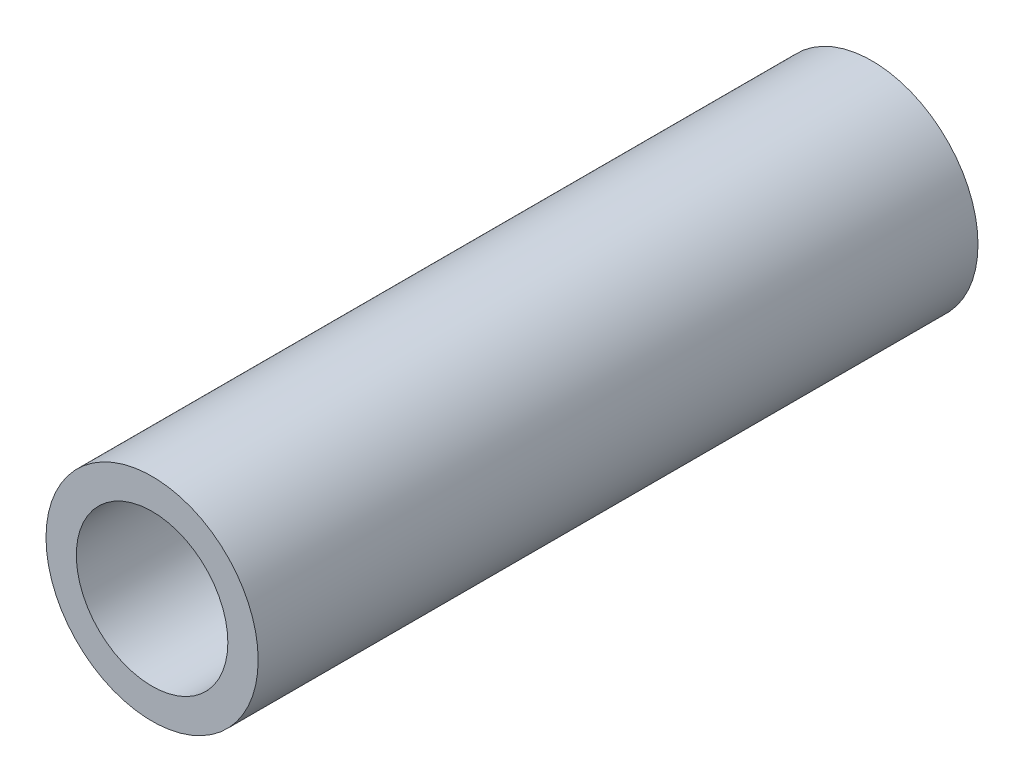
ISO-10303-21;
HEADER;
FILE_DESCRIPTION(('STEP AP214'),'2;1');
FILE_NAME('part.step','',(''),(''),'','','');
FILE_SCHEMA(('AUTOMOTIVE_DESIGN { 1 0 10303 214 1 1 1 1 }'));
ENDSEC;
DATA;
#1=APPLICATION_CONTEXT('core data for automotive mechanical design processes');
#2=APPLICATION_PROTOCOL_DEFINITION('international standard','automotive_design',2000,#1);
#3=PRODUCT_CONTEXT('',#1,'mechanical');
#4=PRODUCT('Part','Part','',(#3));
#5=PRODUCT_RELATED_PRODUCT_CATEGORY('part','',(#4));
#6=PRODUCT_DEFINITION_FORMATION('','',#4);
#7=PRODUCT_DEFINITION_CONTEXT('part definition',#1,'design');
#8=PRODUCT_DEFINITION('design','',#6,#7);
#9=PRODUCT_DEFINITION_SHAPE('','',#8);
#10=(LENGTH_UNIT() NAMED_UNIT(*) SI_UNIT(.MILLI.,.METRE.));
#11=(NAMED_UNIT(*) PLANE_ANGLE_UNIT() SI_UNIT($,.RADIAN.));
#12=(NAMED_UNIT(*) SI_UNIT($,.STERADIAN.) SOLID_ANGLE_UNIT());
#13=UNCERTAINTY_MEASURE_WITH_UNIT(LENGTH_MEASURE(1.E-05),#10,'distance_accuracy_value','');
#14=(GEOMETRIC_REPRESENTATION_CONTEXT(3) GLOBAL_UNCERTAINTY_ASSIGNED_CONTEXT((#13)) GLOBAL_UNIT_ASSIGNED_CONTEXT((#10,
#11,#12)) REPRESENTATION_CONTEXT('',''));
#15=CARTESIAN_POINT('',(0.,0.,0.));
#16=DIRECTION('',(0.,0.,1.));
#17=DIRECTION('',(1.,0.,0.));
#18=AXIS2_PLACEMENT_3D('',#15,#16,#17);
#19=CARTESIAN_POINT('',(0.,0.,95.));
#20=DIRECTION('',(0.,0.,1.));
#21=DIRECTION('',(1.,0.,0.));
#22=AXIS2_PLACEMENT_3D('',#19,#20,#21);
#23=PLANE('',#22);
#24=CARTESIAN_POINT('',(0.,0.,95.));
#25=DIRECTION('',(0.,0.,1.));
#26=DIRECTION('',(1.,0.,0.));
#27=AXIS2_PLACEMENT_3D('',#24,#25,#26);
#28=CIRCLE('',#27,14.);
#29=CARTESIAN_POINT('',(14.,0.,95.));
#30=VERTEX_POINT('',#29);
#31=EDGE_CURVE('E10',#30,#30,#28,.T.);
#32=ORIENTED_EDGE('',*,*,#31,.T.);
#33=EDGE_LOOP('',(#32));
#34=FACE_BOUND('',#33,.T.);
#35=CARTESIAN_POINT('',(0.,0.,95.));
#36=DIRECTION('',(0.,0.,1.));
#37=DIRECTION('',(1.,0.,0.));
#38=AXIS2_PLACEMENT_3D('',#35,#36,#37);
#39=CIRCLE('',#38,10.);
#40=CARTESIAN_POINT('',(10.,0.,95.));
#41=VERTEX_POINT('',#40);
#42=EDGE_CURVE('E57',#41,#41,#39,.T.);
#43=ORIENTED_EDGE('',*,*,#42,.F.);
#44=EDGE_LOOP('',(#43));
#45=FACE_BOUND('',#44,.T.);
#46=ADVANCED_FACE('F43',(#34,#45),#23,.T.);
#47=CARTESIAN_POINT('',(0.,0.,0.));
#48=DIRECTION('',(0.,0.,1.));
#49=DIRECTION('',(1.,0.,0.));
#50=AXIS2_PLACEMENT_3D('',#47,#48,#49);
#51=PLANE('',#50);
#52=CARTESIAN_POINT('',(0.,0.,0.));
#53=DIRECTION('',(0.,0.,1.));
#54=DIRECTION('',(1.,0.,0.));
#55=AXIS2_PLACEMENT_3D('',#52,#53,#54);
#56=CIRCLE('',#55,14.);
#57=CARTESIAN_POINT('',(14.,0.,0.));
#58=VERTEX_POINT('',#57);
#59=EDGE_CURVE('E48',#58,#58,#56,.T.);
#60=ORIENTED_EDGE('',*,*,#59,.F.);
#61=EDGE_LOOP('',(#60));
#62=FACE_BOUND('',#61,.T.);
#63=CARTESIAN_POINT('',(0.,0.,0.));
#64=DIRECTION('',(0.,0.,1.));
#65=DIRECTION('',(1.,0.,0.));
#66=AXIS2_PLACEMENT_3D('',#63,#64,#65);
#67=CIRCLE('',#66,10.);
#68=CARTESIAN_POINT('',(10.,0.,0.));
#69=VERTEX_POINT('',#68);
#70=EDGE_CURVE('E59',#69,#69,#67,.T.);
#71=ORIENTED_EDGE('',*,*,#70,.T.);
#72=EDGE_LOOP('',(#71));
#73=FACE_BOUND('',#72,.T.);
#74=ADVANCED_FACE('F71',(#62,#73),#51,.F.);
#75=CARTESIAN_POINT('',(0.,0.,95.));
#76=DIRECTION('',(0.,0.,-1.));
#77=DIRECTION('',(-1.,0.,0.));
#78=AXIS2_PLACEMENT_3D('',#75,#76,#77);
#79=CYLINDRICAL_SURFACE('',#78,14.);
#80=ORIENTED_EDGE('',*,*,#31,.F.);
#81=EDGE_LOOP('',(#80));
#82=FACE_BOUND('',#81,.T.);
#83=ORIENTED_EDGE('',*,*,#59,.T.);
#84=EDGE_LOOP('',(#83));
#85=FACE_BOUND('',#84,.T.);
#86=ADVANCED_FACE('F46',(#82,#85),#79,.T.);
#87=CARTESIAN_POINT('',(0.,0.,95.));
#88=DIRECTION('',(0.,0.,-1.));
#89=DIRECTION('',(-1.,0.,0.));
#90=AXIS2_PLACEMENT_3D('',#87,#88,#89);
#91=CYLINDRICAL_SURFACE('',#90,10.);
#92=ORIENTED_EDGE('',*,*,#42,.T.);
#93=EDGE_LOOP('',(#92));
#94=FACE_BOUND('',#93,.T.);
#95=ORIENTED_EDGE('',*,*,#70,.F.);
#96=EDGE_LOOP('',(#95));
#97=FACE_BOUND('',#96,.T.);
#98=ADVANCED_FACE('F67',(#94,#97),#91,.F.);
#99=CLOSED_SHELL('',(#46,#74,#86,#98));
#100=MANIFOLD_SOLID_BREP('B2',#99);
#101=ADVANCED_BREP_SHAPE_REPRESENTATION('',(#18,#100),#14);
#102=SHAPE_DEFINITION_REPRESENTATION(#9,#101);
ENDSEC;
END-ISO-10303-21;
